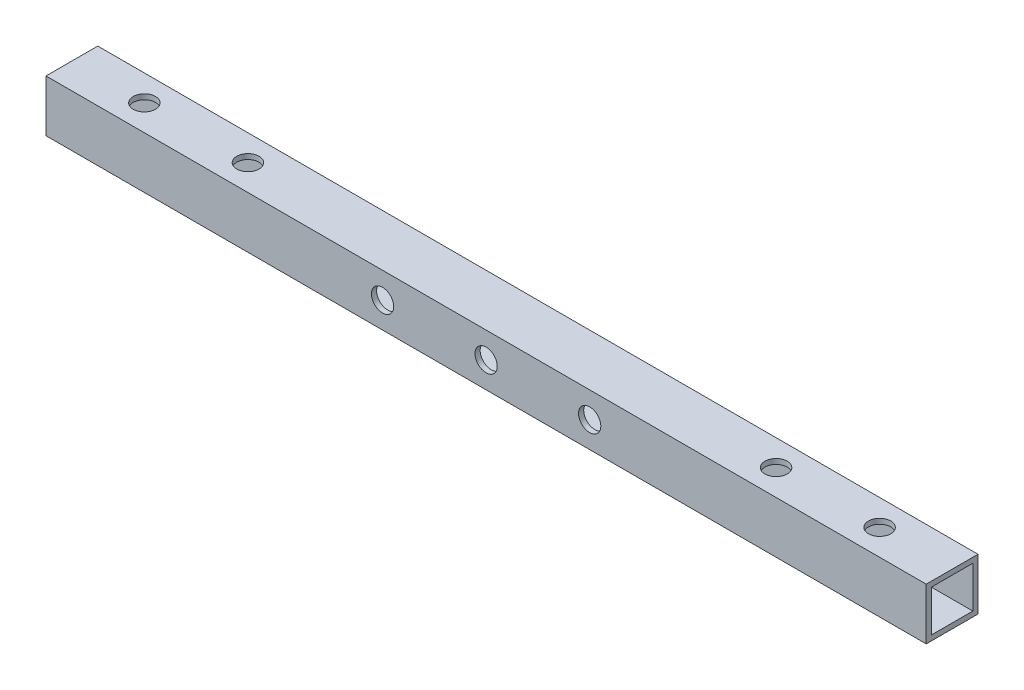
ISO-10303-21;
HEADER;
FILE_DESCRIPTION(('STEP AP214'),'2;1');
FILE_NAME('part.step','',(''),(''),'','','');
FILE_SCHEMA(('AUTOMOTIVE_DESIGN { 1 0 10303 214 1 1 1 1 }'));
ENDSEC;
DATA;
#1=APPLICATION_CONTEXT('core data for automotive mechanical design processes');
#2=APPLICATION_PROTOCOL_DEFINITION('international standard','automotive_design',2000,#1);
#3=PRODUCT_CONTEXT('',#1,'mechanical');
#4=PRODUCT('Part','Part','',(#3));
#5=PRODUCT_RELATED_PRODUCT_CATEGORY('part','',(#4));
#6=PRODUCT_DEFINITION_FORMATION('','',#4);
#7=PRODUCT_DEFINITION_CONTEXT('part definition',#1,'design');
#8=PRODUCT_DEFINITION('design','',#6,#7);
#9=PRODUCT_DEFINITION_SHAPE('','',#8);
#10=(LENGTH_UNIT() NAMED_UNIT(*) SI_UNIT(.MILLI.,.METRE.));
#11=(NAMED_UNIT(*) PLANE_ANGLE_UNIT() SI_UNIT($,.RADIAN.));
#12=(NAMED_UNIT(*) SI_UNIT($,.STERADIAN.) SOLID_ANGLE_UNIT());
#13=UNCERTAINTY_MEASURE_WITH_UNIT(LENGTH_MEASURE(1.E-05),#10,'distance_accuracy_value','');
#14=(GEOMETRIC_REPRESENTATION_CONTEXT(3) GLOBAL_UNCERTAINTY_ASSIGNED_CONTEXT((#13)) GLOBAL_UNIT_ASSIGNED_CONTEXT((#10,
#11,#12)) REPRESENTATION_CONTEXT('',''));
#15=CARTESIAN_POINT('',(0.,0.,0.));
#16=DIRECTION('',(0.,0.,1.));
#17=DIRECTION('',(1.,0.,0.));
#18=AXIS2_PLACEMENT_3D('',#15,#16,#17);
#19=CARTESIAN_POINT('',(170.,0.,0.));
#20=DIRECTION('',(1.,0.,0.));
#21=DIRECTION('',(0.,0.,-1.));
#22=AXIS2_PLACEMENT_3D('',#19,#20,#21);
#23=PLANE('',#22);
#24=DIRECTION('',(0.,-1.,0.));
#25=VECTOR('',#24,1.);
#26=CARTESIAN_POINT('',(170.,0.,0.));
#27=LINE('',#26,#25);
#28=CARTESIAN_POINT('',(170.,10.,0.));
#29=VERTEX_POINT('',#28);
#30=CARTESIAN_POINT('',(170.,0.,0.));
#31=VERTEX_POINT('',#30);
#32=EDGE_CURVE('E164',#29,#31,#27,.T.);
#33=ORIENTED_EDGE('',*,*,#32,.T.);
#34=DIRECTION('',(0.,0.,-1.));
#35=VECTOR('',#34,1.);
#36=CARTESIAN_POINT('',(170.,0.,0.));
#37=LINE('',#36,#35);
#38=CARTESIAN_POINT('',(170.,0.,-10.));
#39=VERTEX_POINT('',#38);
#40=EDGE_CURVE('E167',#31,#39,#37,.T.);
#41=ORIENTED_EDGE('',*,*,#40,.T.);
#42=DIRECTION('',(0.,1.,0.));
#43=VECTOR('',#42,1.);
#44=CARTESIAN_POINT('',(170.,0.,-10.));
#45=LINE('',#44,#43);
#46=CARTESIAN_POINT('',(170.,10.,-10.));
#47=VERTEX_POINT('',#46);
#48=EDGE_CURVE('E170',#39,#47,#45,.T.);
#49=ORIENTED_EDGE('',*,*,#48,.T.);
#50=DIRECTION('',(0.,0.,1.));
#51=VECTOR('',#50,1.);
#52=CARTESIAN_POINT('',(170.,10.,0.));
#53=LINE('',#52,#51);
#54=EDGE_CURVE('E172',#47,#29,#53,.T.);
#55=ORIENTED_EDGE('',*,*,#54,.T.);
#56=EDGE_LOOP('',(#33,#41,#49,#55));
#57=FACE_BOUND('',#56,.T.);
#58=DIRECTION('',(0.,0.,-1.));
#59=VECTOR('',#58,1.);
#60=CARTESIAN_POINT('',(170.,1.,0.));
#61=LINE('',#60,#59);
#62=CARTESIAN_POINT('',(170.,1.,-1.));
#63=VERTEX_POINT('',#62);
#64=CARTESIAN_POINT('',(170.,1.,-9.));
#65=VERTEX_POINT('',#64);
#66=EDGE_CURVE('E134',#63,#65,#61,.T.);
#67=ORIENTED_EDGE('',*,*,#66,.F.);
#68=DIRECTION('',(0.,-1.,0.));
#69=VECTOR('',#68,1.);
#70=CARTESIAN_POINT('',(170.,0.,-1.));
#71=LINE('',#70,#69);
#72=CARTESIAN_POINT('',(170.,9.,-1.));
#73=VERTEX_POINT('',#72);
#74=EDGE_CURVE('E126',#73,#63,#71,.T.);
#75=ORIENTED_EDGE('',*,*,#74,.F.);
#76=DIRECTION('',(0.,0.,1.));
#77=VECTOR('',#76,1.);
#78=CARTESIAN_POINT('',(170.,9.,0.));
#79=LINE('',#78,#77);
#80=CARTESIAN_POINT('',(170.,9.,-9.));
#81=VERTEX_POINT('',#80);
#82=EDGE_CURVE('E148',#81,#73,#79,.T.);
#83=ORIENTED_EDGE('',*,*,#82,.F.);
#84=DIRECTION('',(0.,1.,0.));
#85=VECTOR('',#84,1.);
#86=CARTESIAN_POINT('',(170.,0.,-9.));
#87=LINE('',#86,#85);
#88=EDGE_CURVE('E146',#65,#81,#87,.T.);
#89=ORIENTED_EDGE('',*,*,#88,.F.);
#90=EDGE_LOOP('',(#67,#75,#83,#89));
#91=FACE_BOUND('',#90,.T.);
#92=ADVANCED_FACE('F59',(#57,#91),#23,.T.);
#93=CARTESIAN_POINT('',(0.,0.,0.));
#94=DIRECTION('',(1.,0.,0.));
#95=DIRECTION('',(0.,0.,-1.));
#96=AXIS2_PLACEMENT_3D('',#93,#94,#95);
#97=PLANE('',#96);
#98=DIRECTION('',(0.,-1.,0.));
#99=VECTOR('',#98,1.);
#100=CARTESIAN_POINT('',(0.,0.,0.));
#101=LINE('',#100,#99);
#102=CARTESIAN_POINT('',(0.,10.,0.));
#103=VERTEX_POINT('',#102);
#104=CARTESIAN_POINT('',(0.,0.,0.));
#105=VERTEX_POINT('',#104);
#106=EDGE_CURVE('E142',#103,#105,#101,.T.);
#107=ORIENTED_EDGE('',*,*,#106,.F.);
#108=DIRECTION('',(0.,0.,1.));
#109=VECTOR('',#108,1.);
#110=CARTESIAN_POINT('',(0.,10.,0.));
#111=LINE('',#110,#109);
#112=CARTESIAN_POINT('',(0.,10.,-10.));
#113=VERTEX_POINT('',#112);
#114=EDGE_CURVE('E168',#113,#103,#111,.T.);
#115=ORIENTED_EDGE('',*,*,#114,.F.);
#116=DIRECTION('',(0.,1.,0.));
#117=VECTOR('',#116,1.);
#118=CARTESIAN_POINT('',(0.,0.,-10.));
#119=LINE('',#118,#117);
#120=CARTESIAN_POINT('',(0.,0.,-10.));
#121=VERTEX_POINT('',#120);
#122=EDGE_CURVE('E179',#121,#113,#119,.T.);
#123=ORIENTED_EDGE('',*,*,#122,.F.);
#124=DIRECTION('',(0.,0.,-1.));
#125=VECTOR('',#124,1.);
#126=CARTESIAN_POINT('',(0.,0.,0.));
#127=LINE('',#126,#125);
#128=EDGE_CURVE('E177',#105,#121,#127,.T.);
#129=ORIENTED_EDGE('',*,*,#128,.F.);
#130=EDGE_LOOP('',(#107,#115,#123,#129));
#131=FACE_BOUND('',#130,.T.);
#132=DIRECTION('',(0.,-1.,0.));
#133=VECTOR('',#132,1.);
#134=CARTESIAN_POINT('',(0.,0.,-1.));
#135=LINE('',#134,#133);
#136=CARTESIAN_POINT('',(0.,9.,-1.));
#137=VERTEX_POINT('',#136);
#138=CARTESIAN_POINT('',(0.,1.,-1.));
#139=VERTEX_POINT('',#138);
#140=EDGE_CURVE('E84',#137,#139,#135,.T.);
#141=ORIENTED_EDGE('',*,*,#140,.T.);
#142=DIRECTION('',(0.,0.,-1.));
#143=VECTOR('',#142,1.);
#144=CARTESIAN_POINT('',(0.,1.,0.));
#145=LINE('',#144,#143);
#146=CARTESIAN_POINT('',(0.,1.,-9.));
#147=VERTEX_POINT('',#146);
#148=EDGE_CURVE('E141',#139,#147,#145,.T.);
#149=ORIENTED_EDGE('',*,*,#148,.T.);
#150=DIRECTION('',(0.,1.,0.));
#151=VECTOR('',#150,1.);
#152=CARTESIAN_POINT('',(0.,0.,-9.));
#153=LINE('',#152,#151);
#154=CARTESIAN_POINT('',(0.,9.,-9.));
#155=VERTEX_POINT('',#154);
#156=EDGE_CURVE('E156',#147,#155,#153,.T.);
#157=ORIENTED_EDGE('',*,*,#156,.T.);
#158=DIRECTION('',(0.,0.,1.));
#159=VECTOR('',#158,1.);
#160=CARTESIAN_POINT('',(0.,9.,0.));
#161=LINE('',#160,#159);
#162=EDGE_CURVE('E135',#155,#137,#161,.T.);
#163=ORIENTED_EDGE('',*,*,#162,.T.);
#164=EDGE_LOOP('',(#141,#149,#157,#163));
#165=FACE_BOUND('',#164,.T.);
#166=ADVANCED_FACE('F294',(#131,#165),#97,.F.);
#167=CARTESIAN_POINT('',(170.,0.,0.));
#168=DIRECTION('',(0.,0.,-1.));
#169=DIRECTION('',(-1.,0.,0.));
#170=AXIS2_PLACEMENT_3D('',#167,#168,#169);
#171=PLANE('',#170);
#172=CARTESIAN_POINT('',(105.,5.,0.));
#173=DIRECTION('',(0.,0.,1.));
#174=DIRECTION('',(1.,0.,0.));
#175=AXIS2_PLACEMENT_3D('',#172,#173,#174);
#176=CIRCLE('',#175,2.15000000000002);
#177=CARTESIAN_POINT('',(107.15,5.,0.));
#178=VERTEX_POINT('',#177);
#179=EDGE_CURVE('E335',#178,#178,#176,.T.);
#180=ORIENTED_EDGE('',*,*,#179,.F.);
#181=EDGE_LOOP('',(#180));
#182=FACE_BOUND('',#181,.T.);
#183=CARTESIAN_POINT('',(85.,5.,0.));
#184=DIRECTION('',(0.,0.,1.));
#185=DIRECTION('',(1.,0.,0.));
#186=AXIS2_PLACEMENT_3D('',#183,#184,#185);
#187=CIRCLE('',#186,2.15000000000002);
#188=CARTESIAN_POINT('',(87.15,5.,0.));
#189=VERTEX_POINT('',#188);
#190=EDGE_CURVE('E329',#189,#189,#187,.T.);
#191=ORIENTED_EDGE('',*,*,#190,.F.);
#192=EDGE_LOOP('',(#191));
#193=FACE_BOUND('',#192,.T.);
#194=CARTESIAN_POINT('',(65.,4.99999999999999,0.));
#195=DIRECTION('',(0.,0.,1.));
#196=DIRECTION('',(-1.,0.,0.));
#197=AXIS2_PLACEMENT_3D('',#194,#195,#196);
#198=CIRCLE('',#197,2.15000000000002);
#199=CARTESIAN_POINT('',(62.85,4.99999999999999,0.));
#200=VERTEX_POINT('',#199);
#201=EDGE_CURVE('E221',#200,#200,#198,.T.);
#202=ORIENTED_EDGE('',*,*,#201,.F.);
#203=EDGE_LOOP('',(#202));
#204=FACE_BOUND('',#203,.T.);
#205=ORIENTED_EDGE('',*,*,#106,.T.);
#206=DIRECTION('',(-1.,0.,0.));
#207=VECTOR('',#206,1.);
#208=CARTESIAN_POINT('',(170.,0.,0.));
#209=LINE('',#208,#207);
#210=EDGE_CURVE('E12',#31,#105,#209,.T.);
#211=ORIENTED_EDGE('',*,*,#210,.F.);
#212=ORIENTED_EDGE('',*,*,#32,.F.);
#213=DIRECTION('',(-1.,0.,0.));
#214=VECTOR('',#213,1.);
#215=CARTESIAN_POINT('',(170.,10.,0.));
#216=LINE('',#215,#214);
#217=EDGE_CURVE('E174',#29,#103,#216,.T.);
#218=ORIENTED_EDGE('',*,*,#217,.T.);
#219=EDGE_LOOP('',(#205,#211,#212,#218));
#220=FACE_BOUND('',#219,.T.);
#221=ADVANCED_FACE('F61',(#182,#193,#204,#220),#171,.F.);
#222=CARTESIAN_POINT('',(170.,0.,0.));
#223=DIRECTION('',(0.,1.,0.));
#224=DIRECTION('',(0.,0.,1.));
#225=AXIS2_PLACEMENT_3D('',#222,#223,#224);
#226=PLANE('',#225);
#227=CARTESIAN_POINT('',(14.,0.,-5.));
#228=DIRECTION('',(0.,1.,0.));
#229=DIRECTION('',(0.,0.,1.));
#230=AXIS2_PLACEMENT_3D('',#227,#228,#229);
#231=CIRCLE('',#230,2.15000000000002);
#232=CARTESIAN_POINT('',(14.,0.,-2.84999999999998));
#233=VERTEX_POINT('',#232);
#234=EDGE_CURVE('E193',#233,#233,#231,.F.);
#235=ORIENTED_EDGE('',*,*,#234,.F.);
#236=EDGE_LOOP('',(#235));
#237=FACE_BOUND('',#236,.T.);
#238=CARTESIAN_POINT('',(34.,0.,-5.));
#239=DIRECTION('',(0.,1.,0.));
#240=DIRECTION('',(0.,0.,1.));
#241=AXIS2_PLACEMENT_3D('',#238,#239,#240);
#242=CIRCLE('',#241,2.15000000000002);
#243=CARTESIAN_POINT('',(34.,0.,-2.84999999999998));
#244=VERTEX_POINT('',#243);
#245=EDGE_CURVE('E231',#244,#244,#242,.F.);
#246=ORIENTED_EDGE('',*,*,#245,.F.);
#247=EDGE_LOOP('',(#246));
#248=FACE_BOUND('',#247,.T.);
#249=CARTESIAN_POINT('',(136.,0.,-5.00000000000001));
#250=DIRECTION('',(0.,1.,0.));
#251=DIRECTION('',(0.,0.,1.));
#252=AXIS2_PLACEMENT_3D('',#249,#250,#251);
#253=CIRCLE('',#252,2.15000000000002);
#254=CARTESIAN_POINT('',(136.,0.,-2.85));
#255=VERTEX_POINT('',#254);
#256=EDGE_CURVE('E237',#255,#255,#253,.F.);
#257=ORIENTED_EDGE('',*,*,#256,.F.);
#258=EDGE_LOOP('',(#257));
#259=FACE_BOUND('',#258,.T.);
#260=CARTESIAN_POINT('',(156.,0.,-5.00000000000002));
#261=DIRECTION('',(0.,1.,0.));
#262=DIRECTION('',(0.,0.,1.));
#263=AXIS2_PLACEMENT_3D('',#260,#261,#262);
#264=CIRCLE('',#263,2.14999999999996);
#265=CARTESIAN_POINT('',(156.,0.,-2.85000000000006));
#266=VERTEX_POINT('',#265);
#267=EDGE_CURVE('E243',#266,#266,#264,.F.);
#268=ORIENTED_EDGE('',*,*,#267,.F.);
#269=EDGE_LOOP('',(#268));
#270=FACE_BOUND('',#269,.T.);
#271=ORIENTED_EDGE('',*,*,#128,.T.);
#272=DIRECTION('',(-1.,0.,0.));
#273=VECTOR('',#272,1.);
#274=CARTESIAN_POINT('',(170.,0.,-10.));
#275=LINE('',#274,#273);
#276=EDGE_CURVE('E68',#39,#121,#275,.T.);
#277=ORIENTED_EDGE('',*,*,#276,.F.);
#278=ORIENTED_EDGE('',*,*,#40,.F.);
#279=ORIENTED_EDGE('',*,*,#210,.T.);
#280=EDGE_LOOP('',(#271,#277,#278,#279));
#281=FACE_BOUND('',#280,.T.);
#282=ADVANCED_FACE('F280',(#237,#248,#259,#270,#281),#226,.F.);
#283=CARTESIAN_POINT('',(170.,0.,-10.));
#284=DIRECTION('',(0.,0.,1.));
#285=DIRECTION('',(1.,0.,0.));
#286=AXIS2_PLACEMENT_3D('',#283,#284,#285);
#287=PLANE('',#286);
#288=CARTESIAN_POINT('',(105.,5.,-10.));
#289=DIRECTION('',(0.,0.,1.));
#290=DIRECTION('',(1.,0.,0.));
#291=AXIS2_PLACEMENT_3D('',#288,#289,#290);
#292=CIRCLE('',#291,2.15000000000002);
#293=CARTESIAN_POINT('',(107.15,5.,-10.));
#294=VERTEX_POINT('',#293);
#295=EDGE_CURVE('E208',#294,#294,#292,.T.);
#296=ORIENTED_EDGE('',*,*,#295,.T.);
#297=EDGE_LOOP('',(#296));
#298=FACE_BOUND('',#297,.T.);
#299=CARTESIAN_POINT('',(85.,5.,-10.));
#300=DIRECTION('',(0.,0.,1.));
#301=DIRECTION('',(1.,0.,0.));
#302=AXIS2_PLACEMENT_3D('',#299,#300,#301);
#303=CIRCLE('',#302,2.15000000000002);
#304=CARTESIAN_POINT('',(87.15,5.,-10.));
#305=VERTEX_POINT('',#304);
#306=EDGE_CURVE('E324',#305,#305,#303,.T.);
#307=ORIENTED_EDGE('',*,*,#306,.T.);
#308=EDGE_LOOP('',(#307));
#309=FACE_BOUND('',#308,.T.);
#310=CARTESIAN_POINT('',(65.,4.99999999999999,-10.));
#311=DIRECTION('',(0.,0.,1.));
#312=DIRECTION('',(-1.,0.,0.));
#313=AXIS2_PLACEMENT_3D('',#310,#311,#312);
#314=CIRCLE('',#313,2.15000000000002);
#315=CARTESIAN_POINT('',(62.85,4.99999999999999,-10.));
#316=VERTEX_POINT('',#315);
#317=EDGE_CURVE('E327',#316,#316,#314,.T.);
#318=ORIENTED_EDGE('',*,*,#317,.T.);
#319=EDGE_LOOP('',(#318));
#320=FACE_BOUND('',#319,.T.);
#321=ORIENTED_EDGE('',*,*,#122,.T.);
#322=DIRECTION('',(-1.,0.,0.));
#323=VECTOR('',#322,1.);
#324=CARTESIAN_POINT('',(170.,10.,-10.));
#325=LINE('',#324,#323);
#326=EDGE_CURVE('E184',#47,#113,#325,.T.);
#327=ORIENTED_EDGE('',*,*,#326,.F.);
#328=ORIENTED_EDGE('',*,*,#48,.F.);
#329=ORIENTED_EDGE('',*,*,#276,.T.);
#330=EDGE_LOOP('',(#321,#327,#328,#329));
#331=FACE_BOUND('',#330,.T.);
#332=ADVANCED_FACE('F283',(#298,#309,#320,#331),#287,.F.);
#333=CARTESIAN_POINT('',(170.,10.,0.));
#334=DIRECTION('',(0.,-1.,0.));
#335=DIRECTION('',(0.,0.,-1.));
#336=AXIS2_PLACEMENT_3D('',#333,#334,#335);
#337=PLANE('',#336);
#338=CARTESIAN_POINT('',(14.,10.,-5.));
#339=DIRECTION('',(0.,1.,0.));
#340=DIRECTION('',(0.,0.,1.));
#341=AXIS2_PLACEMENT_3D('',#338,#339,#340);
#342=CIRCLE('',#341,2.15000000000002);
#343=CARTESIAN_POINT('',(14.,10.,-2.84999999999998));
#344=VERTEX_POINT('',#343);
#345=EDGE_CURVE('E228',#344,#344,#342,.T.);
#346=ORIENTED_EDGE('',*,*,#345,.F.);
#347=EDGE_LOOP('',(#346));
#348=FACE_BOUND('',#347,.T.);
#349=CARTESIAN_POINT('',(34.,10.,-5.));
#350=DIRECTION('',(0.,1.,0.));
#351=DIRECTION('',(0.,0.,1.));
#352=AXIS2_PLACEMENT_3D('',#349,#350,#351);
#353=CIRCLE('',#352,2.15000000000002);
#354=CARTESIAN_POINT('',(34.,10.,-2.84999999999998));
#355=VERTEX_POINT('',#354);
#356=EDGE_CURVE('E234',#355,#355,#353,.T.);
#357=ORIENTED_EDGE('',*,*,#356,.F.);
#358=EDGE_LOOP('',(#357));
#359=FACE_BOUND('',#358,.T.);
#360=CARTESIAN_POINT('',(136.,10.,-5.00000000000001));
#361=DIRECTION('',(0.,1.,0.));
#362=DIRECTION('',(0.,0.,-1.));
#363=AXIS2_PLACEMENT_3D('',#360,#361,#362);
#364=CIRCLE('',#363,2.15000000000002);
#365=CARTESIAN_POINT('',(136.,10.,-7.15000000000003));
#366=VERTEX_POINT('',#365);
#367=EDGE_CURVE('E240',#366,#366,#364,.T.);
#368=ORIENTED_EDGE('',*,*,#367,.F.);
#369=EDGE_LOOP('',(#368));
#370=FACE_BOUND('',#369,.T.);
#371=CARTESIAN_POINT('',(156.,10.,-5.00000000000002));
#372=DIRECTION('',(0.,1.,0.));
#373=DIRECTION('',(0.,0.,-1.));
#374=AXIS2_PLACEMENT_3D('',#371,#372,#373);
#375=CIRCLE('',#374,2.14999999999996);
#376=CARTESIAN_POINT('',(156.,10.,-7.14999999999998));
#377=VERTEX_POINT('',#376);
#378=EDGE_CURVE('E227',#377,#377,#375,.T.);
#379=ORIENTED_EDGE('',*,*,#378,.F.);
#380=EDGE_LOOP('',(#379));
#381=FACE_BOUND('',#380,.T.);
#382=ORIENTED_EDGE('',*,*,#114,.T.);
#383=ORIENTED_EDGE('',*,*,#217,.F.);
#384=ORIENTED_EDGE('',*,*,#54,.F.);
#385=ORIENTED_EDGE('',*,*,#326,.T.);
#386=EDGE_LOOP('',(#382,#383,#384,#385));
#387=FACE_BOUND('',#386,.T.);
#388=ADVANCED_FACE('F298',(#348,#359,#370,#381,#387),#337,.F.);
#389=CARTESIAN_POINT('',(170.,0.,-1.));
#390=DIRECTION('',(0.,0.,-1.));
#391=DIRECTION('',(-1.,0.,0.));
#392=AXIS2_PLACEMENT_3D('',#389,#390,#391);
#393=PLANE('',#392);
#394=CARTESIAN_POINT('',(105.,5.,-0.999999999999999));
#395=DIRECTION('',(0.,0.,-1.));
#396=DIRECTION('',(-1.,0.,0.));
#397=AXIS2_PLACEMENT_3D('',#394,#395,#396);
#398=CIRCLE('',#397,2.15000000000002);
#399=CARTESIAN_POINT('',(102.85,5.,-0.999999999999999));
#400=VERTEX_POINT('',#399);
#401=EDGE_CURVE('E224',#400,#400,#398,.T.);
#402=ORIENTED_EDGE('',*,*,#401,.F.);
#403=EDGE_LOOP('',(#402));
#404=FACE_BOUND('',#403,.T.);
#405=CARTESIAN_POINT('',(85.,5.,-0.999999999999999));
#406=DIRECTION('',(0.,0.,-1.));
#407=DIRECTION('',(-1.,0.,0.));
#408=AXIS2_PLACEMENT_3D('',#405,#406,#407);
#409=CIRCLE('',#408,2.15000000000002);
#410=CARTESIAN_POINT('',(82.85,5.,-0.999999999999999));
#411=VERTEX_POINT('',#410);
#412=EDGE_CURVE('E211',#411,#411,#409,.T.);
#413=ORIENTED_EDGE('',*,*,#412,.F.);
#414=EDGE_LOOP('',(#413));
#415=FACE_BOUND('',#414,.T.);
#416=CARTESIAN_POINT('',(65.,4.99999999999999,-0.999999999999999));
#417=DIRECTION('',(0.,0.,-1.));
#418=DIRECTION('',(-1.,0.,0.));
#419=AXIS2_PLACEMENT_3D('',#416,#417,#418);
#420=CIRCLE('',#419,2.15000000000002);
#421=CARTESIAN_POINT('',(62.85,4.99999999999999,-0.999999999999999));
#422=VERTEX_POINT('',#421);
#423=EDGE_CURVE('E207',#422,#422,#420,.T.);
#424=ORIENTED_EDGE('',*,*,#423,.F.);
#425=EDGE_LOOP('',(#424));
#426=FACE_BOUND('',#425,.T.);
#427=ORIENTED_EDGE('',*,*,#140,.F.);
#428=DIRECTION('',(-1.,0.,0.));
#429=VECTOR('',#428,1.);
#430=CARTESIAN_POINT('',(170.,9.,-1.));
#431=LINE('',#430,#429);
#432=EDGE_CURVE('E130',#73,#137,#431,.T.);
#433=ORIENTED_EDGE('',*,*,#432,.F.);
#434=ORIENTED_EDGE('',*,*,#74,.T.);
#435=DIRECTION('',(-1.,0.,0.));
#436=VECTOR('',#435,1.);
#437=CARTESIAN_POINT('',(170.,1.,-1.));
#438=LINE('',#437,#436);
#439=EDGE_CURVE('E129',#63,#139,#438,.T.);
#440=ORIENTED_EDGE('',*,*,#439,.T.);
#441=EDGE_LOOP('',(#427,#433,#434,#440));
#442=FACE_BOUND('',#441,.T.);
#443=ADVANCED_FACE('F128',(#404,#415,#426,#442),#393,.T.);
#444=CARTESIAN_POINT('',(170.,1.,0.));
#445=DIRECTION('',(0.,1.,0.));
#446=DIRECTION('',(0.,0.,1.));
#447=AXIS2_PLACEMENT_3D('',#444,#445,#446);
#448=PLANE('',#447);
#449=CARTESIAN_POINT('',(14.,1.,-5.));
#450=DIRECTION('',(0.,1.,0.));
#451=DIRECTION('',(0.,0.,1.));
#452=AXIS2_PLACEMENT_3D('',#449,#450,#451);
#453=CIRCLE('',#452,2.15000000000002);
#454=CARTESIAN_POINT('',(14.,1.,-2.84999999999998));
#455=VERTEX_POINT('',#454);
#456=EDGE_CURVE('E154',#455,#455,#453,.T.);
#457=ORIENTED_EDGE('',*,*,#456,.F.);
#458=EDGE_LOOP('',(#457));
#459=FACE_BOUND('',#458,.T.);
#460=CARTESIAN_POINT('',(34.,1.,-5.));
#461=DIRECTION('',(0.,1.,0.));
#462=DIRECTION('',(0.,0.,1.));
#463=AXIS2_PLACEMENT_3D('',#460,#461,#462);
#464=CIRCLE('',#463,2.15000000000002);
#465=CARTESIAN_POINT('',(34.,1.,-2.84999999999998));
#466=VERTEX_POINT('',#465);
#467=EDGE_CURVE('E201',#466,#466,#464,.T.);
#468=ORIENTED_EDGE('',*,*,#467,.F.);
#469=EDGE_LOOP('',(#468));
#470=FACE_BOUND('',#469,.T.);
#471=CARTESIAN_POINT('',(136.,1.,-5.00000000000001));
#472=DIRECTION('',(0.,1.,0.));
#473=DIRECTION('',(0.,0.,1.));
#474=AXIS2_PLACEMENT_3D('',#471,#472,#473);
#475=CIRCLE('',#474,2.15000000000002);
#476=CARTESIAN_POINT('',(136.,1.,-2.85));
#477=VERTEX_POINT('',#476);
#478=EDGE_CURVE('E197',#477,#477,#475,.T.);
#479=ORIENTED_EDGE('',*,*,#478,.F.);
#480=EDGE_LOOP('',(#479));
#481=FACE_BOUND('',#480,.T.);
#482=CARTESIAN_POINT('',(156.,1.,-5.00000000000002));
#483=DIRECTION('',(0.,1.,0.));
#484=DIRECTION('',(0.,0.,1.));
#485=AXIS2_PLACEMENT_3D('',#482,#483,#484);
#486=CIRCLE('',#485,2.14999999999996);
#487=CARTESIAN_POINT('',(156.,1.,-2.85000000000006));
#488=VERTEX_POINT('',#487);
#489=EDGE_CURVE('E192',#488,#488,#486,.T.);
#490=ORIENTED_EDGE('',*,*,#489,.F.);
#491=EDGE_LOOP('',(#490));
#492=FACE_BOUND('',#491,.T.);
#493=ORIENTED_EDGE('',*,*,#148,.F.);
#494=ORIENTED_EDGE('',*,*,#439,.F.);
#495=ORIENTED_EDGE('',*,*,#66,.T.);
#496=DIRECTION('',(-1.,0.,0.));
#497=VECTOR('',#496,1.);
#498=CARTESIAN_POINT('',(170.,1.,-9.));
#499=LINE('',#498,#497);
#500=EDGE_CURVE('E143',#65,#147,#499,.T.);
#501=ORIENTED_EDGE('',*,*,#500,.T.);
#502=EDGE_LOOP('',(#493,#494,#495,#501));
#503=FACE_BOUND('',#502,.T.);
#504=ADVANCED_FACE('F138',(#459,#470,#481,#492,#503),#448,.T.);
#505=CARTESIAN_POINT('',(170.,0.,-9.));
#506=DIRECTION('',(0.,0.,1.));
#507=DIRECTION('',(1.,0.,0.));
#508=AXIS2_PLACEMENT_3D('',#505,#506,#507);
#509=PLANE('',#508);
#510=CARTESIAN_POINT('',(105.,5.,-9.));
#511=DIRECTION('',(0.,0.,1.));
#512=DIRECTION('',(1.,0.,0.));
#513=AXIS2_PLACEMENT_3D('',#510,#511,#512);
#514=CIRCLE('',#513,2.15000000000002);
#515=CARTESIAN_POINT('',(107.15,5.,-9.));
#516=VERTEX_POINT('',#515);
#517=EDGE_CURVE('E63',#516,#516,#514,.T.);
#518=ORIENTED_EDGE('',*,*,#517,.F.);
#519=EDGE_LOOP('',(#518));
#520=FACE_BOUND('',#519,.T.);
#521=CARTESIAN_POINT('',(85.,5.,-9.));
#522=DIRECTION('',(0.,0.,1.));
#523=DIRECTION('',(1.,0.,0.));
#524=AXIS2_PLACEMENT_3D('',#521,#522,#523);
#525=CIRCLE('',#524,2.15000000000002);
#526=CARTESIAN_POINT('',(87.15,5.,-9.));
#527=VERTEX_POINT('',#526);
#528=EDGE_CURVE('E209',#527,#527,#525,.T.);
#529=ORIENTED_EDGE('',*,*,#528,.F.);
#530=EDGE_LOOP('',(#529));
#531=FACE_BOUND('',#530,.T.);
#532=CARTESIAN_POINT('',(65.,4.99999999999999,-9.));
#533=DIRECTION('',(0.,0.,1.));
#534=DIRECTION('',(1.,0.,0.));
#535=AXIS2_PLACEMENT_3D('',#532,#533,#534);
#536=CIRCLE('',#535,2.15000000000002);
#537=CARTESIAN_POINT('',(67.15,4.99999999999999,-9.));
#538=VERTEX_POINT('',#537);
#539=EDGE_CURVE('E205',#538,#538,#536,.T.);
#540=ORIENTED_EDGE('',*,*,#539,.F.);
#541=EDGE_LOOP('',(#540));
#542=FACE_BOUND('',#541,.T.);
#543=ORIENTED_EDGE('',*,*,#156,.F.);
#544=ORIENTED_EDGE('',*,*,#500,.F.);
#545=ORIENTED_EDGE('',*,*,#88,.T.);
#546=DIRECTION('',(-1.,0.,0.));
#547=VECTOR('',#546,1.);
#548=CARTESIAN_POINT('',(170.,9.,-9.));
#549=LINE('',#548,#547);
#550=EDGE_CURVE('E76',#81,#155,#549,.T.);
#551=ORIENTED_EDGE('',*,*,#550,.T.);
#552=EDGE_LOOP('',(#543,#544,#545,#551));
#553=FACE_BOUND('',#552,.T.);
#554=ADVANCED_FACE('F263',(#520,#531,#542,#553),#509,.T.);
#555=CARTESIAN_POINT('',(170.,9.,0.));
#556=DIRECTION('',(0.,-1.,0.));
#557=DIRECTION('',(0.,0.,-1.));
#558=AXIS2_PLACEMENT_3D('',#555,#556,#557);
#559=PLANE('',#558);
#560=CARTESIAN_POINT('',(14.,9.,-5.));
#561=DIRECTION('',(0.,-1.,0.));
#562=DIRECTION('',(0.,0.,-1.));
#563=AXIS2_PLACEMENT_3D('',#560,#561,#562);
#564=CIRCLE('',#563,2.15000000000002);
#565=CARTESIAN_POINT('',(14.,9.,-7.15000000000002));
#566=VERTEX_POINT('',#565);
#567=EDGE_CURVE('E202',#566,#566,#564,.T.);
#568=ORIENTED_EDGE('',*,*,#567,.F.);
#569=EDGE_LOOP('',(#568));
#570=FACE_BOUND('',#569,.T.);
#571=CARTESIAN_POINT('',(34.,9.,-5.));
#572=DIRECTION('',(0.,-1.,0.));
#573=DIRECTION('',(0.,0.,-1.));
#574=AXIS2_PLACEMENT_3D('',#571,#572,#573);
#575=CIRCLE('',#574,2.15000000000002);
#576=CARTESIAN_POINT('',(34.,9.,-7.15000000000002));
#577=VERTEX_POINT('',#576);
#578=EDGE_CURVE('E198',#577,#577,#575,.T.);
#579=ORIENTED_EDGE('',*,*,#578,.F.);
#580=EDGE_LOOP('',(#579));
#581=FACE_BOUND('',#580,.T.);
#582=CARTESIAN_POINT('',(136.,9.,-5.00000000000001));
#583=DIRECTION('',(0.,-1.,0.));
#584=DIRECTION('',(0.,0.,-1.));
#585=AXIS2_PLACEMENT_3D('',#582,#583,#584);
#586=CIRCLE('',#585,2.15000000000002);
#587=CARTESIAN_POINT('',(136.,9.,-7.15000000000003));
#588=VERTEX_POINT('',#587);
#589=EDGE_CURVE('E194',#588,#588,#586,.T.);
#590=ORIENTED_EDGE('',*,*,#589,.F.);
#591=EDGE_LOOP('',(#590));
#592=FACE_BOUND('',#591,.T.);
#593=CARTESIAN_POINT('',(156.,9.,-5.00000000000002));
#594=DIRECTION('',(0.,-1.,0.));
#595=DIRECTION('',(0.,0.,-1.));
#596=AXIS2_PLACEMENT_3D('',#593,#594,#595);
#597=CIRCLE('',#596,2.14999999999996);
#598=CARTESIAN_POINT('',(156.,9.,-7.14999999999998));
#599=VERTEX_POINT('',#598);
#600=EDGE_CURVE('E189',#599,#599,#597,.T.);
#601=ORIENTED_EDGE('',*,*,#600,.F.);
#602=EDGE_LOOP('',(#601));
#603=FACE_BOUND('',#602,.T.);
#604=ORIENTED_EDGE('',*,*,#162,.F.);
#605=ORIENTED_EDGE('',*,*,#550,.F.);
#606=ORIENTED_EDGE('',*,*,#82,.T.);
#607=ORIENTED_EDGE('',*,*,#432,.T.);
#608=EDGE_LOOP('',(#604,#605,#606,#607));
#609=FACE_BOUND('',#608,.T.);
#610=ADVANCED_FACE('F375',(#570,#581,#592,#603,#609),#559,.T.);
#611=CARTESIAN_POINT('',(156.,-6.08111831820435,-5.00000000000002));
#612=DIRECTION('',(0.,1.,0.));
#613=DIRECTION('',(0.,0.,1.));
#614=AXIS2_PLACEMENT_3D('',#611,#612,#613);
#615=CYLINDRICAL_SURFACE('',#614,2.14999999999996);
#616=ORIENTED_EDGE('',*,*,#600,.T.);
#617=EDGE_LOOP('',(#616));
#618=FACE_BOUND('',#617,.T.);
#619=ORIENTED_EDGE('',*,*,#378,.T.);
#620=EDGE_LOOP('',(#619));
#621=FACE_BOUND('',#620,.T.);
#622=ADVANCED_FACE('F277',(#618,#621),#615,.F.);
#623=CARTESIAN_POINT('',(136.,-6.08111831820435,-5.00000000000001));
#624=DIRECTION('',(0.,1.,0.));
#625=DIRECTION('',(0.,0.,1.));
#626=AXIS2_PLACEMENT_3D('',#623,#624,#625);
#627=CYLINDRICAL_SURFACE('',#626,2.15000000000002);
#628=ORIENTED_EDGE('',*,*,#589,.T.);
#629=EDGE_LOOP('',(#628));
#630=FACE_BOUND('',#629,.T.);
#631=ORIENTED_EDGE('',*,*,#367,.T.);
#632=EDGE_LOOP('',(#631));
#633=FACE_BOUND('',#632,.T.);
#634=ADVANCED_FACE('F385',(#630,#633),#627,.F.);
#635=CARTESIAN_POINT('',(34.,-6.08111831820435,-5.));
#636=DIRECTION('',(0.,1.,0.));
#637=DIRECTION('',(0.,0.,1.));
#638=AXIS2_PLACEMENT_3D('',#635,#636,#637);
#639=CYLINDRICAL_SURFACE('',#638,2.15000000000002);
#640=ORIENTED_EDGE('',*,*,#578,.T.);
#641=EDGE_LOOP('',(#640));
#642=FACE_BOUND('',#641,.T.);
#643=ORIENTED_EDGE('',*,*,#356,.T.);
#644=EDGE_LOOP('',(#643));
#645=FACE_BOUND('',#644,.T.);
#646=ADVANCED_FACE('F392',(#642,#645),#639,.F.);
#647=CARTESIAN_POINT('',(14.,-6.08111831820435,-5.));
#648=DIRECTION('',(0.,1.,0.));
#649=DIRECTION('',(0.,0.,1.));
#650=AXIS2_PLACEMENT_3D('',#647,#648,#649);
#651=CYLINDRICAL_SURFACE('',#650,2.15000000000002);
#652=ORIENTED_EDGE('',*,*,#567,.T.);
#653=EDGE_LOOP('',(#652));
#654=FACE_BOUND('',#653,.T.);
#655=ORIENTED_EDGE('',*,*,#345,.T.);
#656=EDGE_LOOP('',(#655));
#657=FACE_BOUND('',#656,.T.);
#658=ADVANCED_FACE('F275',(#654,#657),#651,.F.);
#659=ORIENTED_EDGE('',*,*,#489,.T.);
#660=EDGE_LOOP('',(#659));
#661=FACE_BOUND('',#660,.T.);
#662=ORIENTED_EDGE('',*,*,#267,.T.);
#663=EDGE_LOOP('',(#662));
#664=FACE_BOUND('',#663,.T.);
#665=ADVANCED_FACE('F271',(#661,#664),#615,.F.);
#666=ORIENTED_EDGE('',*,*,#478,.T.);
#667=EDGE_LOOP('',(#666));
#668=FACE_BOUND('',#667,.T.);
#669=ORIENTED_EDGE('',*,*,#256,.T.);
#670=EDGE_LOOP('',(#669));
#671=FACE_BOUND('',#670,.T.);
#672=ADVANCED_FACE('F274',(#668,#671),#627,.F.);
#673=ORIENTED_EDGE('',*,*,#467,.T.);
#674=EDGE_LOOP('',(#673));
#675=FACE_BOUND('',#674,.T.);
#676=ORIENTED_EDGE('',*,*,#245,.T.);
#677=EDGE_LOOP('',(#676));
#678=FACE_BOUND('',#677,.T.);
#679=ADVANCED_FACE('F370',(#675,#678),#639,.F.);
#680=ORIENTED_EDGE('',*,*,#456,.T.);
#681=EDGE_LOOP('',(#680));
#682=FACE_BOUND('',#681,.T.);
#683=ORIENTED_EDGE('',*,*,#234,.T.);
#684=EDGE_LOOP('',(#683));
#685=FACE_BOUND('',#684,.T.);
#686=ADVANCED_FACE('F258',(#682,#685),#651,.F.);
#687=CARTESIAN_POINT('',(65.,4.99999999999999,-10.));
#688=DIRECTION('',(0.,0.,1.));
#689=DIRECTION('',(1.,0.,0.));
#690=AXIS2_PLACEMENT_3D('',#687,#688,#689);
#691=CYLINDRICAL_SURFACE('',#690,2.15000000000002);
#692=ORIENTED_EDGE('',*,*,#539,.T.);
#693=EDGE_LOOP('',(#692));
#694=FACE_BOUND('',#693,.T.);
#695=ORIENTED_EDGE('',*,*,#317,.F.);
#696=EDGE_LOOP('',(#695));
#697=FACE_BOUND('',#696,.T.);
#698=ADVANCED_FACE('F353',(#694,#697),#691,.F.);
#699=CARTESIAN_POINT('',(85.,5.,-10.));
#700=DIRECTION('',(0.,0.,1.));
#701=DIRECTION('',(1.,0.,0.));
#702=AXIS2_PLACEMENT_3D('',#699,#700,#701);
#703=CYLINDRICAL_SURFACE('',#702,2.15000000000002);
#704=ORIENTED_EDGE('',*,*,#528,.T.);
#705=EDGE_LOOP('',(#704));
#706=FACE_BOUND('',#705,.T.);
#707=ORIENTED_EDGE('',*,*,#306,.F.);
#708=EDGE_LOOP('',(#707));
#709=FACE_BOUND('',#708,.T.);
#710=ADVANCED_FACE('F360',(#706,#709),#703,.F.);
#711=CARTESIAN_POINT('',(105.,5.,-10.));
#712=DIRECTION('',(0.,0.,1.));
#713=DIRECTION('',(1.,0.,0.));
#714=AXIS2_PLACEMENT_3D('',#711,#712,#713);
#715=CYLINDRICAL_SURFACE('',#714,2.15000000000002);
#716=ORIENTED_EDGE('',*,*,#517,.T.);
#717=EDGE_LOOP('',(#716));
#718=FACE_BOUND('',#717,.T.);
#719=ORIENTED_EDGE('',*,*,#295,.F.);
#720=EDGE_LOOP('',(#719));
#721=FACE_BOUND('',#720,.T.);
#722=ADVANCED_FACE('F351',(#718,#721),#715,.F.);
#723=ORIENTED_EDGE('',*,*,#423,.T.);
#724=EDGE_LOOP('',(#723));
#725=FACE_BOUND('',#724,.T.);
#726=ORIENTED_EDGE('',*,*,#201,.T.);
#727=EDGE_LOOP('',(#726));
#728=FACE_BOUND('',#727,.T.);
#729=ADVANCED_FACE('F348',(#725,#728),#691,.F.);
#730=ORIENTED_EDGE('',*,*,#412,.T.);
#731=EDGE_LOOP('',(#730));
#732=FACE_BOUND('',#731,.T.);
#733=ORIENTED_EDGE('',*,*,#190,.T.);
#734=EDGE_LOOP('',(#733));
#735=FACE_BOUND('',#734,.T.);
#736=ADVANCED_FACE('F350',(#732,#735),#703,.F.);
#737=ORIENTED_EDGE('',*,*,#401,.T.);
#738=EDGE_LOOP('',(#737));
#739=FACE_BOUND('',#738,.T.);
#740=ORIENTED_EDGE('',*,*,#179,.T.);
#741=EDGE_LOOP('',(#740));
#742=FACE_BOUND('',#741,.T.);
#743=ADVANCED_FACE('F340',(#739,#742),#715,.F.);
#744=CLOSED_SHELL('',(#92,#166,#221,#282,#332,#388,#443,#504,#554,#610,#622,#634,#646,#658,#665,
#672,#679,#686,#698,#710,#722,#729,#736,#743));
#745=MANIFOLD_SOLID_BREP('B2',#744);
#746=ADVANCED_BREP_SHAPE_REPRESENTATION('',(#18,#745),#14);
#747=SHAPE_DEFINITION_REPRESENTATION(#9,#746);
ENDSEC;
END-ISO-10303-21;
